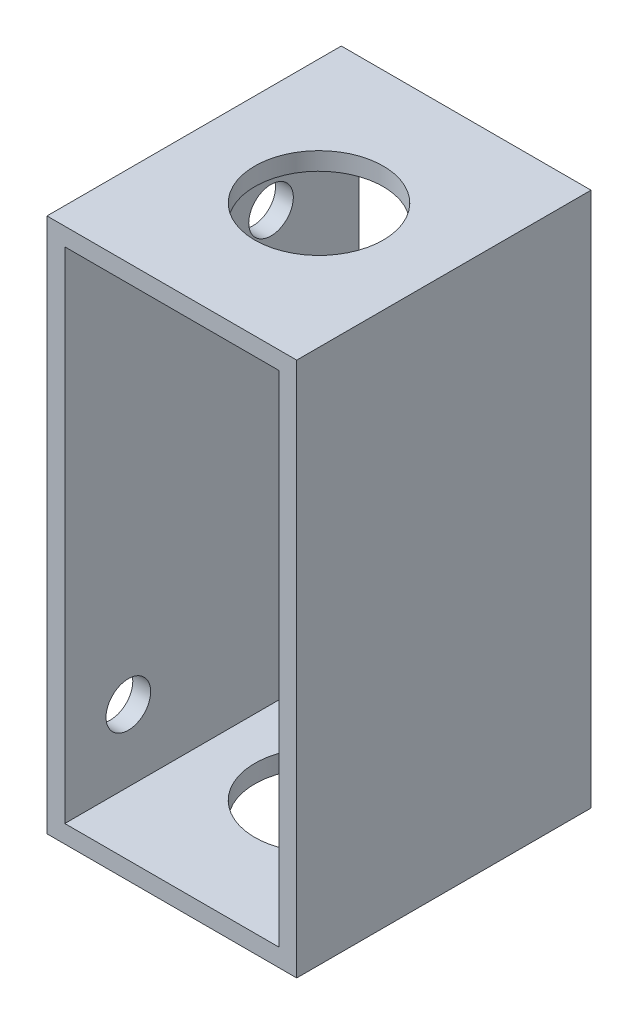
ISO-10303-21;
HEADER;
FILE_DESCRIPTION(('STEP AP214'),'2;1');
FILE_NAME('part.step','',(''),(''),'','','');
FILE_SCHEMA(('AUTOMOTIVE_DESIGN { 1 0 10303 214 1 1 1 1 }'));
ENDSEC;
DATA;
#1=APPLICATION_CONTEXT('core data for automotive mechanical design processes');
#2=APPLICATION_PROTOCOL_DEFINITION('international standard','automotive_design',2000,#1);
#3=PRODUCT_CONTEXT('',#1,'mechanical');
#4=PRODUCT('Part','Part','',(#3));
#5=PRODUCT_RELATED_PRODUCT_CATEGORY('part','',(#4));
#6=PRODUCT_DEFINITION_FORMATION('','',#4);
#7=PRODUCT_DEFINITION_CONTEXT('part definition',#1,'design');
#8=PRODUCT_DEFINITION('design','',#6,#7);
#9=PRODUCT_DEFINITION_SHAPE('','',#8);
#10=(LENGTH_UNIT() NAMED_UNIT(*) SI_UNIT(.MILLI.,.METRE.));
#11=(NAMED_UNIT(*) PLANE_ANGLE_UNIT() SI_UNIT($,.RADIAN.));
#12=(NAMED_UNIT(*) SI_UNIT($,.STERADIAN.) SOLID_ANGLE_UNIT());
#13=UNCERTAINTY_MEASURE_WITH_UNIT(LENGTH_MEASURE(1.E-05),#10,'distance_accuracy_value','');
#14=(GEOMETRIC_REPRESENTATION_CONTEXT(3) GLOBAL_UNCERTAINTY_ASSIGNED_CONTEXT((#13)) GLOBAL_UNIT_ASSIGNED_CONTEXT((#10,
#11,#12)) REPRESENTATION_CONTEXT('',''));
#15=CARTESIAN_POINT('',(0.,0.,0.));
#16=DIRECTION('',(0.,0.,1.));
#17=DIRECTION('',(1.,0.,0.));
#18=AXIS2_PLACEMENT_3D('',#15,#16,#17);
#19=CARTESIAN_POINT('',(0.,0.,16.5));
#20=DIRECTION('',(1.,0.,0.));
#21=DIRECTION('',(0.,0.,-1.));
#22=AXIS2_PLACEMENT_3D('',#19,#20,#21);
#23=PLANE('',#22);
#24=CARTESIAN_POINT('',(0.,25.,4.93966677809301));
#25=DIRECTION('',(1.,0.,0.));
#26=DIRECTION('',(0.,0.,-1.));
#27=AXIS2_PLACEMENT_3D('',#24,#25,#26);
#28=CIRCLE('',#27,1.25);
#29=CARTESIAN_POINT('',(0.,25.,3.68966677809301));
#30=VERTEX_POINT('',#29);
#31=EDGE_CURVE('E220',#30,#30,#28,.T.);
#32=ORIENTED_EDGE('',*,*,#31,.T.);
#33=EDGE_LOOP('',(#32));
#34=FACE_BOUND('',#33,.T.);
#35=CARTESIAN_POINT('',(0.,5.,12.939666778093));
#36=DIRECTION('',(1.,0.,0.));
#37=DIRECTION('',(0.,0.,-1.));
#38=AXIS2_PLACEMENT_3D('',#35,#36,#37);
#39=CIRCLE('',#38,1.25);
#40=CARTESIAN_POINT('',(0.,5.,11.689666778093));
#41=VERTEX_POINT('',#40);
#42=EDGE_CURVE('E216',#41,#41,#39,.T.);
#43=ORIENTED_EDGE('',*,*,#42,.T.);
#44=EDGE_LOOP('',(#43));
#45=FACE_BOUND('',#44,.T.);
#46=DIRECTION('',(0.,-1.,0.));
#47=VECTOR('',#46,1.);
#48=CARTESIAN_POINT('',(0.,0.,0.));
#49=LINE('',#48,#47);
#50=CARTESIAN_POINT('',(0.,30.,0.));
#51=VERTEX_POINT('',#50);
#52=CARTESIAN_POINT('',(0.,0.,0.));
#53=VERTEX_POINT('',#52);
#54=EDGE_CURVE('E140',#51,#53,#49,.T.);
#55=ORIENTED_EDGE('',*,*,#54,.T.);
#56=DIRECTION('',(0.,0.,-1.));
#57=VECTOR('',#56,1.);
#58=CARTESIAN_POINT('',(0.,0.,16.5));
#59=LINE('',#58,#57);
#60=CARTESIAN_POINT('',(0.,0.,16.5));
#61=VERTEX_POINT('',#60);
#62=EDGE_CURVE('E182',#61,#53,#59,.T.);
#63=ORIENTED_EDGE('',*,*,#62,.F.);
#64=DIRECTION('',(0.,-1.,0.));
#65=VECTOR('',#64,1.);
#66=CARTESIAN_POINT('',(0.,0.,16.5));
#67=LINE('',#66,#65);
#68=CARTESIAN_POINT('',(0.,30.,16.5));
#69=VERTEX_POINT('',#68);
#70=EDGE_CURVE('E145',#69,#61,#67,.T.);
#71=ORIENTED_EDGE('',*,*,#70,.F.);
#72=DIRECTION('',(0.,0.,-1.));
#73=VECTOR('',#72,1.);
#74=CARTESIAN_POINT('',(0.,30.,16.5));
#75=LINE('',#74,#73);
#76=EDGE_CURVE('E159',#69,#51,#75,.T.);
#77=ORIENTED_EDGE('',*,*,#76,.T.);
#78=EDGE_LOOP('',(#55,#63,#71,#77));
#79=FACE_BOUND('',#78,.T.);
#80=ADVANCED_FACE('F44',(#34,#45,#79),#23,.F.);
#81=CARTESIAN_POINT('',(0.,0.,16.5));
#82=DIRECTION('',(0.,1.,0.));
#83=DIRECTION('',(0.,0.,1.));
#84=AXIS2_PLACEMENT_3D('',#81,#82,#83);
#85=PLANE('',#84);
#86=CARTESIAN_POINT('',(7.,0.,8.25));
#87=DIRECTION('',(0.,1.,0.));
#88=DIRECTION('',(0.,0.,1.));
#89=AXIS2_PLACEMENT_3D('',#86,#87,#88);
#90=CIRCLE('',#89,3.6);
#91=CARTESIAN_POINT('',(7.,0.,11.85));
#92=VERTEX_POINT('',#91);
#93=EDGE_CURVE('E202',#92,#92,#90,.F.);
#94=ORIENTED_EDGE('',*,*,#93,.F.);
#95=EDGE_LOOP('',(#94));
#96=FACE_BOUND('',#95,.T.);
#97=DIRECTION('',(1.,0.,0.));
#98=VECTOR('',#97,1.);
#99=CARTESIAN_POINT('',(0.,0.,0.));
#100=LINE('',#99,#98);
#101=CARTESIAN_POINT('',(14.,0.,0.));
#102=VERTEX_POINT('',#101);
#103=EDGE_CURVE('E163',#53,#102,#100,.T.);
#104=ORIENTED_EDGE('',*,*,#103,.T.);
#105=DIRECTION('',(0.,0.,-1.));
#106=VECTOR('',#105,1.);
#107=CARTESIAN_POINT('',(14.,0.,16.5));
#108=LINE('',#107,#106);
#109=CARTESIAN_POINT('',(14.,0.,16.5));
#110=VERTEX_POINT('',#109);
#111=EDGE_CURVE('E178',#110,#102,#108,.T.);
#112=ORIENTED_EDGE('',*,*,#111,.F.);
#113=DIRECTION('',(1.,0.,0.));
#114=VECTOR('',#113,1.);
#115=CARTESIAN_POINT('',(0.,0.,16.5));
#116=LINE('',#115,#114);
#117=EDGE_CURVE('E149',#61,#110,#116,.T.);
#118=ORIENTED_EDGE('',*,*,#117,.F.);
#119=ORIENTED_EDGE('',*,*,#62,.T.);
#120=EDGE_LOOP('',(#104,#112,#118,#119));
#121=FACE_BOUND('',#120,.T.);
#122=ADVANCED_FACE('F247',(#96,#121),#85,.F.);
#123=CARTESIAN_POINT('',(14.,0.,16.5));
#124=DIRECTION('',(-1.,0.,0.));
#125=DIRECTION('',(0.,-1.,0.));
#126=AXIS2_PLACEMENT_3D('',#123,#124,#125);
#127=PLANE('',#126);
#128=DIRECTION('',(0.,1.,0.));
#129=VECTOR('',#128,1.);
#130=CARTESIAN_POINT('',(14.,0.,0.));
#131=LINE('',#130,#129);
#132=CARTESIAN_POINT('',(14.,30.,0.));
#133=VERTEX_POINT('',#132);
#134=EDGE_CURVE('E166',#102,#133,#131,.T.);
#135=ORIENTED_EDGE('',*,*,#134,.T.);
#136=DIRECTION('',(0.,0.,-1.));
#137=VECTOR('',#136,1.);
#138=CARTESIAN_POINT('',(14.,30.,16.5));
#139=LINE('',#138,#137);
#140=CARTESIAN_POINT('',(14.,30.,16.5));
#141=VERTEX_POINT('',#140);
#142=EDGE_CURVE('E174',#141,#133,#139,.T.);
#143=ORIENTED_EDGE('',*,*,#142,.F.);
#144=DIRECTION('',(0.,1.,0.));
#145=VECTOR('',#144,1.);
#146=CARTESIAN_POINT('',(14.,0.,16.5));
#147=LINE('',#146,#145);
#148=EDGE_CURVE('E153',#110,#141,#147,.T.);
#149=ORIENTED_EDGE('',*,*,#148,.F.);
#150=ORIENTED_EDGE('',*,*,#111,.T.);
#151=EDGE_LOOP('',(#135,#143,#149,#150));
#152=FACE_BOUND('',#151,.T.);
#153=ADVANCED_FACE('F251',(#152),#127,.F.);
#154=CARTESIAN_POINT('',(0.,30.,16.5));
#155=DIRECTION('',(0.,-1.,0.));
#156=DIRECTION('',(0.,0.,-1.));
#157=AXIS2_PLACEMENT_3D('',#154,#155,#156);
#158=PLANE('',#157);
#159=CARTESIAN_POINT('',(7.,30.,8.25));
#160=DIRECTION('',(0.,1.,0.));
#161=DIRECTION('',(0.,0.,1.));
#162=AXIS2_PLACEMENT_3D('',#159,#160,#161);
#163=CIRCLE('',#162,3.6);
#164=CARTESIAN_POINT('',(7.,30.,11.85));
#165=VERTEX_POINT('',#164);
#166=EDGE_CURVE('E211',#165,#165,#163,.T.);
#167=ORIENTED_EDGE('',*,*,#166,.F.);
#168=EDGE_LOOP('',(#167));
#169=FACE_BOUND('',#168,.T.);
#170=DIRECTION('',(-1.,0.,0.));
#171=VECTOR('',#170,1.);
#172=CARTESIAN_POINT('',(0.,30.,0.));
#173=LINE('',#172,#171);
#174=EDGE_CURVE('E150',#133,#51,#173,.T.);
#175=ORIENTED_EDGE('',*,*,#174,.T.);
#176=ORIENTED_EDGE('',*,*,#76,.F.);
#177=DIRECTION('',(-1.,0.,0.));
#178=VECTOR('',#177,1.);
#179=CARTESIAN_POINT('',(0.,30.,16.5));
#180=LINE('',#179,#178);
#181=EDGE_CURVE('E156',#141,#69,#180,.T.);
#182=ORIENTED_EDGE('',*,*,#181,.F.);
#183=ORIENTED_EDGE('',*,*,#142,.T.);
#184=EDGE_LOOP('',(#175,#176,#182,#183));
#185=FACE_BOUND('',#184,.T.);
#186=ADVANCED_FACE('F256',(#169,#185),#158,.F.);
#187=CARTESIAN_POINT('',(0.,0.,16.5));
#188=DIRECTION('',(0.,0.,-1.));
#189=DIRECTION('',(-1.,0.,0.));
#190=AXIS2_PLACEMENT_3D('',#187,#188,#189);
#191=PLANE('',#190);
#192=DIRECTION('',(1.,0.,0.));
#193=VECTOR('',#192,1.);
#194=CARTESIAN_POINT('',(1.,1.,16.5));
#195=LINE('',#194,#193);
#196=CARTESIAN_POINT('',(1.,1.,16.5));
#197=VERTEX_POINT('',#196);
#198=CARTESIAN_POINT('',(13.,1.,16.5));
#199=VERTEX_POINT('',#198);
#200=EDGE_CURVE('E122',#197,#199,#195,.T.);
#201=ORIENTED_EDGE('',*,*,#200,.F.);
#202=DIRECTION('',(0.,-1.,0.));
#203=VECTOR('',#202,1.);
#204=CARTESIAN_POINT('',(1.,29.,16.5));
#205=LINE('',#204,#203);
#206=CARTESIAN_POINT('',(1.,29.,16.5));
#207=VERTEX_POINT('',#206);
#208=EDGE_CURVE('E60',#207,#197,#205,.T.);
#209=ORIENTED_EDGE('',*,*,#208,.F.);
#210=DIRECTION('',(-1.,0.,0.));
#211=VECTOR('',#210,1.);
#212=CARTESIAN_POINT('',(1.,29.,16.5));
#213=LINE('',#212,#211);
#214=CARTESIAN_POINT('',(13.,29.,16.5));
#215=VERTEX_POINT('',#214);
#216=EDGE_CURVE('E130',#215,#207,#213,.T.);
#217=ORIENTED_EDGE('',*,*,#216,.F.);
#218=DIRECTION('',(0.,1.,0.));
#219=VECTOR('',#218,1.);
#220=CARTESIAN_POINT('',(13.,29.,16.5));
#221=LINE('',#220,#219);
#222=EDGE_CURVE('E112',#199,#215,#221,.T.);
#223=ORIENTED_EDGE('',*,*,#222,.F.);
#224=EDGE_LOOP('',(#201,#209,#217,#223));
#225=FACE_BOUND('',#224,.T.);
#226=ORIENTED_EDGE('',*,*,#70,.T.);
#227=ORIENTED_EDGE('',*,*,#117,.T.);
#228=ORIENTED_EDGE('',*,*,#148,.T.);
#229=ORIENTED_EDGE('',*,*,#181,.T.);
#230=EDGE_LOOP('',(#226,#227,#228,#229));
#231=FACE_BOUND('',#230,.T.);
#232=ADVANCED_FACE('F127',(#225,#231),#191,.F.);
#233=CARTESIAN_POINT('',(0.,0.,0.));
#234=DIRECTION('',(0.,0.,-1.));
#235=DIRECTION('',(-1.,0.,0.));
#236=AXIS2_PLACEMENT_3D('',#233,#234,#235);
#237=PLANE('',#236);
#238=DIRECTION('',(0.,1.,0.));
#239=VECTOR('',#238,1.);
#240=CARTESIAN_POINT('',(1.,0.,0.));
#241=LINE('',#240,#239);
#242=CARTESIAN_POINT('',(1.,1.,0.));
#243=VERTEX_POINT('',#242);
#244=CARTESIAN_POINT('',(1.,29.,0.));
#245=VERTEX_POINT('',#244);
#246=EDGE_CURVE('E12',#243,#245,#241,.T.);
#247=ORIENTED_EDGE('',*,*,#246,.F.);
#248=DIRECTION('',(-1.,0.,0.));
#249=VECTOR('',#248,1.);
#250=CARTESIAN_POINT('',(0.,1.,0.));
#251=LINE('',#250,#249);
#252=CARTESIAN_POINT('',(13.,1.,0.));
#253=VERTEX_POINT('',#252);
#254=EDGE_CURVE('E186',#253,#243,#251,.T.);
#255=ORIENTED_EDGE('',*,*,#254,.F.);
#256=DIRECTION('',(0.,-1.,0.));
#257=VECTOR('',#256,1.);
#258=CARTESIAN_POINT('',(13.,0.,0.));
#259=LINE('',#258,#257);
#260=CARTESIAN_POINT('',(13.,29.,0.));
#261=VERTEX_POINT('',#260);
#262=EDGE_CURVE('E115',#261,#253,#259,.T.);
#263=ORIENTED_EDGE('',*,*,#262,.F.);
#264=DIRECTION('',(1.,0.,0.));
#265=VECTOR('',#264,1.);
#266=CARTESIAN_POINT('',(0.,29.,0.));
#267=LINE('',#266,#265);
#268=EDGE_CURVE('E53',#245,#261,#267,.T.);
#269=ORIENTED_EDGE('',*,*,#268,.F.);
#270=EDGE_LOOP('',(#247,#255,#263,#269));
#271=FACE_BOUND('',#270,.T.);
#272=ORIENTED_EDGE('',*,*,#54,.F.);
#273=ORIENTED_EDGE('',*,*,#174,.F.);
#274=ORIENTED_EDGE('',*,*,#134,.F.);
#275=ORIENTED_EDGE('',*,*,#103,.F.);
#276=EDGE_LOOP('',(#272,#273,#274,#275));
#277=FACE_BOUND('',#276,.T.);
#278=ADVANCED_FACE('F198',(#271,#277),#237,.T.);
#279=CARTESIAN_POINT('',(1.,29.,-1.2E-05));
#280=DIRECTION('',(-1.,0.,0.));
#281=DIRECTION('',(0.,0.,1.));
#282=AXIS2_PLACEMENT_3D('',#279,#280,#281);
#283=PLANE('',#282);
#284=CARTESIAN_POINT('',(1.,25.,4.93966677809301));
#285=DIRECTION('',(-1.,0.,0.));
#286=DIRECTION('',(0.,0.,1.));
#287=AXIS2_PLACEMENT_3D('',#284,#285,#286);
#288=CIRCLE('',#287,1.25);
#289=CARTESIAN_POINT('',(1.,25.,6.18966677809301));
#290=VERTEX_POINT('',#289);
#291=EDGE_CURVE('E215',#290,#290,#288,.T.);
#292=ORIENTED_EDGE('',*,*,#291,.T.);
#293=EDGE_LOOP('',(#292));
#294=FACE_BOUND('',#293,.T.);
#295=CARTESIAN_POINT('',(1.,5.,12.939666778093));
#296=DIRECTION('',(-1.,0.,0.));
#297=DIRECTION('',(0.,0.,1.));
#298=AXIS2_PLACEMENT_3D('',#295,#296,#297);
#299=CIRCLE('',#298,1.25);
#300=CARTESIAN_POINT('',(1.,5.,14.189666778093));
#301=VERTEX_POINT('',#300);
#302=EDGE_CURVE('E221',#301,#301,#299,.T.);
#303=ORIENTED_EDGE('',*,*,#302,.T.);
#304=EDGE_LOOP('',(#303));
#305=FACE_BOUND('',#304,.T.);
#306=ORIENTED_EDGE('',*,*,#246,.T.);
#307=DIRECTION('',(0.,0.,1.));
#308=VECTOR('',#307,1.);
#309=CARTESIAN_POINT('',(1.,29.,-1.2E-05));
#310=LINE('',#309,#308);
#311=EDGE_CURVE('E137',#245,#207,#310,.T.);
#312=ORIENTED_EDGE('',*,*,#311,.T.);
#313=ORIENTED_EDGE('',*,*,#208,.T.);
#314=DIRECTION('',(0.,0.,1.));
#315=VECTOR('',#314,1.);
#316=CARTESIAN_POINT('',(1.,1.,-1.2E-05));
#317=LINE('',#316,#315);
#318=EDGE_CURVE('E119',#243,#197,#317,.T.);
#319=ORIENTED_EDGE('',*,*,#318,.F.);
#320=EDGE_LOOP('',(#306,#312,#313,#319));
#321=FACE_BOUND('',#320,.T.);
#322=ADVANCED_FACE('F200',(#294,#305,#321),#283,.F.);
#323=CARTESIAN_POINT('',(1.,29.,-1.2E-05));
#324=DIRECTION('',(0.,1.,0.));
#325=DIRECTION('',(0.,0.,1.));
#326=AXIS2_PLACEMENT_3D('',#323,#324,#325);
#327=PLANE('',#326);
#328=CARTESIAN_POINT('',(7.,29.,8.25));
#329=DIRECTION('',(0.,1.,0.));
#330=DIRECTION('',(0.,0.,1.));
#331=AXIS2_PLACEMENT_3D('',#328,#329,#330);
#332=CIRCLE('',#331,3.6);
#333=CARTESIAN_POINT('',(7.,29.,11.85));
#334=VERTEX_POINT('',#333);
#335=EDGE_CURVE('E205',#334,#334,#332,.F.);
#336=ORIENTED_EDGE('',*,*,#335,.F.);
#337=EDGE_LOOP('',(#336));
#338=FACE_BOUND('',#337,.T.);
#339=ORIENTED_EDGE('',*,*,#268,.T.);
#340=DIRECTION('',(0.,0.,1.));
#341=VECTOR('',#340,1.);
#342=CARTESIAN_POINT('',(13.,29.,-1.2E-05));
#343=LINE('',#342,#341);
#344=EDGE_CURVE('E118',#261,#215,#343,.T.);
#345=ORIENTED_EDGE('',*,*,#344,.T.);
#346=ORIENTED_EDGE('',*,*,#216,.T.);
#347=ORIENTED_EDGE('',*,*,#311,.F.);
#348=EDGE_LOOP('',(#339,#345,#346,#347));
#349=FACE_BOUND('',#348,.T.);
#350=ADVANCED_FACE('F195',(#338,#349),#327,.F.);
#351=CARTESIAN_POINT('',(13.,29.,-1.2E-05));
#352=DIRECTION('',(1.,0.,0.));
#353=DIRECTION('',(0.,0.,-1.));
#354=AXIS2_PLACEMENT_3D('',#351,#352,#353);
#355=PLANE('',#354);
#356=ORIENTED_EDGE('',*,*,#262,.T.);
#357=DIRECTION('',(0.,0.,1.));
#358=VECTOR('',#357,1.);
#359=CARTESIAN_POINT('',(13.,1.,-1.2E-05));
#360=LINE('',#359,#358);
#361=EDGE_CURVE('E68',#253,#199,#360,.T.);
#362=ORIENTED_EDGE('',*,*,#361,.T.);
#363=ORIENTED_EDGE('',*,*,#222,.T.);
#364=ORIENTED_EDGE('',*,*,#344,.F.);
#365=EDGE_LOOP('',(#356,#362,#363,#364));
#366=FACE_BOUND('',#365,.T.);
#367=ADVANCED_FACE('F109',(#366),#355,.F.);
#368=CARTESIAN_POINT('',(1.,1.,-1.2E-05));
#369=DIRECTION('',(0.,-1.,0.));
#370=DIRECTION('',(1.,0.,0.));
#371=AXIS2_PLACEMENT_3D('',#368,#369,#370);
#372=PLANE('',#371);
#373=CARTESIAN_POINT('',(7.,1.,8.25));
#374=DIRECTION('',(0.,-1.,0.));
#375=DIRECTION('',(1.,0.,0.));
#376=AXIS2_PLACEMENT_3D('',#373,#374,#375);
#377=CIRCLE('',#376,3.6);
#378=CARTESIAN_POINT('',(10.6,1.,8.25));
#379=VERTEX_POINT('',#378);
#380=EDGE_CURVE('E47',#379,#379,#377,.F.);
#381=ORIENTED_EDGE('',*,*,#380,.F.);
#382=EDGE_LOOP('',(#381));
#383=FACE_BOUND('',#382,.T.);
#384=ORIENTED_EDGE('',*,*,#254,.T.);
#385=ORIENTED_EDGE('',*,*,#318,.T.);
#386=ORIENTED_EDGE('',*,*,#200,.T.);
#387=ORIENTED_EDGE('',*,*,#361,.F.);
#388=EDGE_LOOP('',(#384,#385,#386,#387));
#389=FACE_BOUND('',#388,.T.);
#390=ADVANCED_FACE('F123',(#383,#389),#372,.F.);
#391=CARTESIAN_POINT('',(7.,30.,8.25));
#392=DIRECTION('',(0.,-1.,0.));
#393=DIRECTION('',(0.,0.,-1.));
#394=AXIS2_PLACEMENT_3D('',#391,#392,#393);
#395=CYLINDRICAL_SURFACE('',#394,3.6);
#396=ORIENTED_EDGE('',*,*,#380,.T.);
#397=EDGE_LOOP('',(#396));
#398=FACE_BOUND('',#397,.T.);
#399=ORIENTED_EDGE('',*,*,#93,.T.);
#400=EDGE_LOOP('',(#399));
#401=FACE_BOUND('',#400,.T.);
#402=ADVANCED_FACE('F274',(#398,#401),#395,.F.);
#403=ORIENTED_EDGE('',*,*,#166,.T.);
#404=EDGE_LOOP('',(#403));
#405=FACE_BOUND('',#404,.T.);
#406=ORIENTED_EDGE('',*,*,#335,.T.);
#407=EDGE_LOOP('',(#406));
#408=FACE_BOUND('',#407,.T.);
#409=ADVANCED_FACE('F242',(#405,#408),#395,.F.);
#410=CARTESIAN_POINT('',(4.53553390593274,5.,12.939666778093));
#411=DIRECTION('',(-1.,0.,0.));
#412=DIRECTION('',(0.,0.,1.));
#413=AXIS2_PLACEMENT_3D('',#410,#411,#412);
#414=CYLINDRICAL_SURFACE('',#413,1.25);
#415=ORIENTED_EDGE('',*,*,#302,.F.);
#416=EDGE_LOOP('',(#415));
#417=FACE_BOUND('',#416,.T.);
#418=ORIENTED_EDGE('',*,*,#42,.F.);
#419=EDGE_LOOP('',(#418));
#420=FACE_BOUND('',#419,.T.);
#421=ADVANCED_FACE('F236',(#417,#420),#414,.F.);
#422=CARTESIAN_POINT('',(4.53553390593274,25.,4.93966677809301));
#423=DIRECTION('',(-1.,0.,0.));
#424=DIRECTION('',(0.,0.,1.));
#425=AXIS2_PLACEMENT_3D('',#422,#423,#424);
#426=CYLINDRICAL_SURFACE('',#425,1.25);
#427=ORIENTED_EDGE('',*,*,#291,.F.);
#428=EDGE_LOOP('',(#427));
#429=FACE_BOUND('',#428,.T.);
#430=ORIENTED_EDGE('',*,*,#31,.F.);
#431=EDGE_LOOP('',(#430));
#432=FACE_BOUND('',#431,.T.);
#433=ADVANCED_FACE('F234',(#429,#432),#426,.F.);
#434=CLOSED_SHELL('',(#80,#122,#153,#186,#232,#278,#322,#350,#367,#390,#402,#409,#421,#433));
#435=MANIFOLD_SOLID_BREP('B2',#434);
#436=ADVANCED_BREP_SHAPE_REPRESENTATION('',(#18,#435),#14);
#437=SHAPE_DEFINITION_REPRESENTATION(#9,#436);
ENDSEC;
END-ISO-10303-21;
